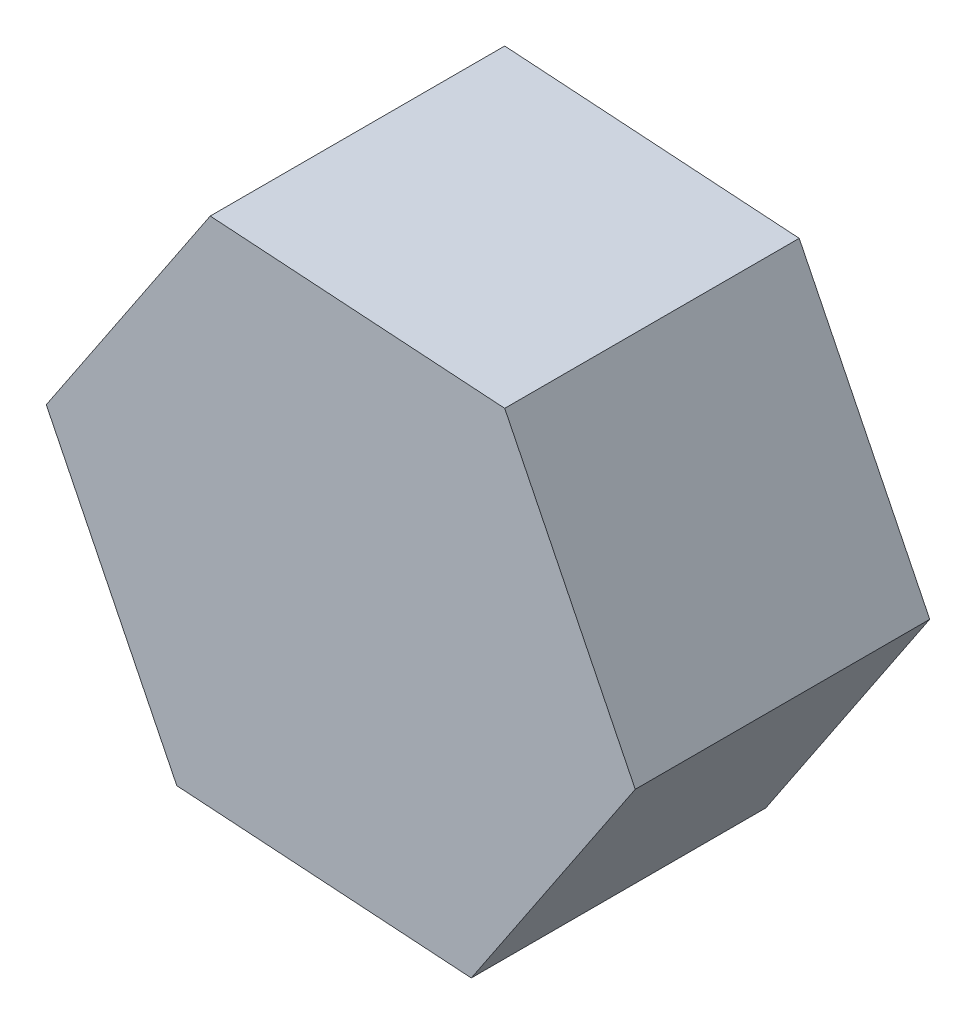
ISO-10303-21;
HEADER;
FILE_DESCRIPTION(('STEP AP214'),'2;1');
FILE_NAME('part.step','',(''),(''),'','','');
FILE_SCHEMA(('AUTOMOTIVE_DESIGN { 1 0 10303 214 1 1 1 1 }'));
ENDSEC;
DATA;
#1=APPLICATION_CONTEXT('core data for automotive mechanical design processes');
#2=APPLICATION_PROTOCOL_DEFINITION('international standard','automotive_design',2000,#1);
#3=PRODUCT_CONTEXT('',#1,'mechanical');
#4=PRODUCT('Part','Part','',(#3));
#5=PRODUCT_RELATED_PRODUCT_CATEGORY('part','',(#4));
#6=PRODUCT_DEFINITION_FORMATION('','',#4);
#7=PRODUCT_DEFINITION_CONTEXT('part definition',#1,'design');
#8=PRODUCT_DEFINITION('design','',#6,#7);
#9=PRODUCT_DEFINITION_SHAPE('','',#8);
#10=(LENGTH_UNIT() NAMED_UNIT(*) SI_UNIT(.MILLI.,.METRE.));
#11=(NAMED_UNIT(*) PLANE_ANGLE_UNIT() SI_UNIT($,.RADIAN.));
#12=(NAMED_UNIT(*) SI_UNIT($,.STERADIAN.) SOLID_ANGLE_UNIT());
#13=UNCERTAINTY_MEASURE_WITH_UNIT(LENGTH_MEASURE(1.E-05),#10,'distance_accuracy_value','');
#14=(GEOMETRIC_REPRESENTATION_CONTEXT(3) GLOBAL_UNCERTAINTY_ASSIGNED_CONTEXT((#13)) GLOBAL_UNIT_ASSIGNED_CONTEXT((#10,
#11,#12)) REPRESENTATION_CONTEXT('',''));
#15=CARTESIAN_POINT('',(0.,0.,0.));
#16=DIRECTION('',(0.,0.,1.));
#17=DIRECTION('',(1.,0.,0.));
#18=AXIS2_PLACEMENT_3D('',#15,#16,#17);
#19=CARTESIAN_POINT('',(12.,-0.786541064159204,12.));
#20=DIRECTION('',(-0.896873457556997,-0.442287238262374,0.));
#21=DIRECTION('',(0.442287238262374,-0.896873457556997,0.));
#22=AXIS2_PLACEMENT_3D('',#19,#20,#21);
#23=PLANE('',#22);
#24=DIRECTION('',(-0.442287238262374,0.896873457556997,0.));
#25=VECTOR('',#24,1.);
#26=CARTESIAN_POINT('',(12.,-0.786541064159204,0.));
#27=LINE('',#26,#25);
#28=CARTESIAN_POINT('',(12.,-0.786541064159204,0.));
#29=VERTEX_POINT('',#28);
#30=CARTESIAN_POINT('',(6.68116454268152,9.99903431333366,0.));
#31=VERTEX_POINT('',#30);
#32=EDGE_CURVE('E121',#29,#31,#27,.T.);
#33=ORIENTED_EDGE('',*,*,#32,.T.);
#34=DIRECTION('',(0.,0.,-1.));
#35=VECTOR('',#34,1.);
#36=CARTESIAN_POINT('',(6.68116454268152,9.99903431333366,12.));
#37=LINE('',#36,#35);
#38=CARTESIAN_POINT('',(6.68116454268152,9.99903431333366,12.));
#39=VERTEX_POINT('',#38);
#40=EDGE_CURVE('E11',#39,#31,#37,.T.);
#41=ORIENTED_EDGE('',*,*,#40,.F.);
#42=DIRECTION('',(-0.442287238262374,0.896873457556997,0.));
#43=VECTOR('',#42,1.);
#44=CARTESIAN_POINT('',(12.,-0.786541064159204,12.));
#45=LINE('',#44,#43);
#46=CARTESIAN_POINT('',(12.,-0.786541064159204,12.));
#47=VERTEX_POINT('',#46);
#48=EDGE_CURVE('E131',#47,#39,#45,.T.);
#49=ORIENTED_EDGE('',*,*,#48,.F.);
#50=DIRECTION('',(0.,0.,-1.));
#51=VECTOR('',#50,1.);
#52=CARTESIAN_POINT('',(12.,-0.786541064159204,12.));
#53=LINE('',#52,#51);
#54=EDGE_CURVE('E117',#47,#29,#53,.T.);
#55=ORIENTED_EDGE('',*,*,#54,.T.);
#56=EDGE_LOOP('',(#33,#41,#49,#55));
#57=FACE_BOUND('',#56,.T.);
#58=ADVANCED_FACE('F37',(#57),#23,.F.);
#59=CARTESIAN_POINT('',(6.68116454268152,9.99903431333366,12.));
#60=DIRECTION('',(-0.0654047446736224,-0.997858817355531,0.));
#61=DIRECTION('',(0.997858817355531,-0.0654047446736224,0.));
#62=AXIS2_PLACEMENT_3D('',#59,#60,#61);
#63=PLANE('',#62);
#64=DIRECTION('',(-0.997858817355531,0.0654047446736224,0.));
#65=VECTOR('',#64,1.);
#66=CARTESIAN_POINT('',(6.68116454268152,9.99903431333366,0.));
#67=LINE('',#66,#65);
#68=CARTESIAN_POINT('',(-5.31883545731848,10.7855753774929,0.));
#69=VERTEX_POINT('',#68);
#70=EDGE_CURVE('E124',#31,#69,#67,.T.);
#71=ORIENTED_EDGE('',*,*,#70,.T.);
#72=DIRECTION('',(0.,0.,-1.));
#73=VECTOR('',#72,1.);
#74=CARTESIAN_POINT('',(-5.31883545731848,10.7855753774929,12.));
#75=LINE('',#74,#73);
#76=CARTESIAN_POINT('',(-5.31883545731848,10.7855753774929,12.));
#77=VERTEX_POINT('',#76);
#78=EDGE_CURVE('E45',#77,#69,#75,.T.);
#79=ORIENTED_EDGE('',*,*,#78,.F.);
#80=DIRECTION('',(-0.997858817355531,0.0654047446736224,0.));
#81=VECTOR('',#80,1.);
#82=CARTESIAN_POINT('',(6.68116454268152,9.99903431333366,12.));
#83=LINE('',#82,#81);
#84=EDGE_CURVE('E90',#39,#77,#83,.T.);
#85=ORIENTED_EDGE('',*,*,#84,.F.);
#86=ORIENTED_EDGE('',*,*,#40,.T.);
#87=EDGE_LOOP('',(#71,#79,#85,#86));
#88=FACE_BOUND('',#87,.T.);
#89=ADVANCED_FACE('F155',(#88),#63,.F.);
#90=CARTESIAN_POINT('',(-5.31883545731848,10.7855753774929,12.));
#91=DIRECTION('',(0.831468712883375,-0.555571579093157,0.));
#92=DIRECTION('',(0.555571579093157,0.831468712883375,0.));
#93=AXIS2_PLACEMENT_3D('',#90,#91,#92);
#94=PLANE('',#93);
#95=DIRECTION('',(-0.555571579093157,-0.831468712883375,0.));
#96=VECTOR('',#95,1.);
#97=CARTESIAN_POINT('',(-5.31883545731848,10.7855753774929,0.));
#98=LINE('',#97,#96);
#99=CARTESIAN_POINT('',(-12.,0.786541064159204,0.));
#100=VERTEX_POINT('',#99);
#101=EDGE_CURVE('E126',#69,#100,#98,.T.);
#102=ORIENTED_EDGE('',*,*,#101,.T.);
#103=DIRECTION('',(0.,0.,-1.));
#104=VECTOR('',#103,1.);
#105=CARTESIAN_POINT('',(-12.,0.786541064159204,12.));
#106=LINE('',#105,#104);
#107=CARTESIAN_POINT('',(-12.,0.786541064159204,12.));
#108=VERTEX_POINT('',#107);
#109=EDGE_CURVE('E112',#108,#100,#106,.T.);
#110=ORIENTED_EDGE('',*,*,#109,.F.);
#111=DIRECTION('',(-0.555571579093157,-0.831468712883375,0.));
#112=VECTOR('',#111,1.);
#113=CARTESIAN_POINT('',(-5.31883545731848,10.7855753774929,12.));
#114=LINE('',#113,#112);
#115=EDGE_CURVE('E103',#77,#108,#114,.T.);
#116=ORIENTED_EDGE('',*,*,#115,.F.);
#117=ORIENTED_EDGE('',*,*,#78,.T.);
#118=EDGE_LOOP('',(#102,#110,#116,#117));
#119=FACE_BOUND('',#118,.T.);
#120=ADVANCED_FACE('F137',(#119),#94,.F.);
#121=CARTESIAN_POINT('',(-12.,0.786541064159204,12.));
#122=DIRECTION('',(0.896873457556997,0.442287238262374,0.));
#123=DIRECTION('',(-0.442287238262374,0.896873457556997,0.));
#124=AXIS2_PLACEMENT_3D('',#121,#122,#123);
#125=PLANE('',#124);
#126=DIRECTION('',(0.442287238262374,-0.896873457556997,0.));
#127=VECTOR('',#126,1.);
#128=CARTESIAN_POINT('',(-12.,0.786541064159204,0.));
#129=LINE('',#128,#127);
#130=CARTESIAN_POINT('',(-6.68116454268151,-9.99903431333367,0.));
#131=VERTEX_POINT('',#130);
#132=EDGE_CURVE('E111',#100,#131,#129,.T.);
#133=ORIENTED_EDGE('',*,*,#132,.T.);
#134=DIRECTION('',(0.,0.,-1.));
#135=VECTOR('',#134,1.);
#136=CARTESIAN_POINT('',(-6.68116454268151,-9.99903431333367,12.));
#137=LINE('',#136,#135);
#138=CARTESIAN_POINT('',(-6.68116454268151,-9.99903431333367,12.));
#139=VERTEX_POINT('',#138);
#140=EDGE_CURVE('E108',#139,#131,#137,.T.);
#141=ORIENTED_EDGE('',*,*,#140,.F.);
#142=DIRECTION('',(0.442287238262374,-0.896873457556997,0.));
#143=VECTOR('',#142,1.);
#144=CARTESIAN_POINT('',(-12.,0.786541064159204,12.));
#145=LINE('',#144,#143);
#146=EDGE_CURVE('E97',#108,#139,#145,.T.);
#147=ORIENTED_EDGE('',*,*,#146,.F.);
#148=ORIENTED_EDGE('',*,*,#109,.T.);
#149=EDGE_LOOP('',(#133,#141,#147,#148));
#150=FACE_BOUND('',#149,.T.);
#151=ADVANCED_FACE('F109',(#150),#125,.F.);
#152=CARTESIAN_POINT('',(-6.68116454268151,-9.99903431333367,12.));
#153=DIRECTION('',(0.0654047446736221,0.997858817355531,0.));
#154=DIRECTION('',(-0.997858817355531,0.0654047446736221,0.));
#155=AXIS2_PLACEMENT_3D('',#152,#153,#154);
#156=PLANE('',#155);
#157=DIRECTION('',(0.997858817355531,-0.0654047446736221,0.));
#158=VECTOR('',#157,1.);
#159=CARTESIAN_POINT('',(-6.68116454268151,-9.99903431333367,0.));
#160=LINE('',#159,#158);
#161=CARTESIAN_POINT('',(5.31883545731849,-10.7855753774929,0.));
#162=VERTEX_POINT('',#161);
#163=EDGE_CURVE('E76',#131,#162,#160,.T.);
#164=ORIENTED_EDGE('',*,*,#163,.T.);
#165=DIRECTION('',(0.,0.,-1.));
#166=VECTOR('',#165,1.);
#167=CARTESIAN_POINT('',(5.31883545731849,-10.7855753774929,12.));
#168=LINE('',#167,#166);
#169=CARTESIAN_POINT('',(5.31883545731849,-10.7855753774929,12.));
#170=VERTEX_POINT('',#169);
#171=EDGE_CURVE('E113',#170,#162,#168,.T.);
#172=ORIENTED_EDGE('',*,*,#171,.F.);
#173=DIRECTION('',(0.997858817355531,-0.0654047446736221,0.));
#174=VECTOR('',#173,1.);
#175=CARTESIAN_POINT('',(-6.68116454268151,-9.99903431333367,12.));
#176=LINE('',#175,#174);
#177=EDGE_CURVE('E101',#139,#170,#176,.T.);
#178=ORIENTED_EDGE('',*,*,#177,.F.);
#179=ORIENTED_EDGE('',*,*,#140,.T.);
#180=EDGE_LOOP('',(#164,#172,#178,#179));
#181=FACE_BOUND('',#180,.T.);
#182=ADVANCED_FACE('F115',(#181),#156,.F.);
#183=CARTESIAN_POINT('',(5.31883545731849,-10.7855753774929,12.));
#184=DIRECTION('',(-0.831468712883375,0.555571579093157,0.));
#185=DIRECTION('',(-0.555571579093157,-0.831468712883375,0.));
#186=AXIS2_PLACEMENT_3D('',#183,#184,#185);
#187=PLANE('',#186);
#188=DIRECTION('',(0.555571579093157,0.831468712883375,0.));
#189=VECTOR('',#188,1.);
#190=CARTESIAN_POINT('',(5.31883545731849,-10.7855753774929,0.));
#191=LINE('',#190,#189);
#192=EDGE_CURVE('E82',#162,#29,#191,.T.);
#193=ORIENTED_EDGE('',*,*,#192,.T.);
#194=ORIENTED_EDGE('',*,*,#54,.F.);
#195=DIRECTION('',(0.555571579093157,0.831468712883375,0.));
#196=VECTOR('',#195,1.);
#197=CARTESIAN_POINT('',(5.31883545731849,-10.7855753774929,12.));
#198=LINE('',#197,#196);
#199=EDGE_CURVE('E53',#170,#47,#198,.T.);
#200=ORIENTED_EDGE('',*,*,#199,.F.);
#201=ORIENTED_EDGE('',*,*,#171,.T.);
#202=EDGE_LOOP('',(#193,#194,#200,#201));
#203=FACE_BOUND('',#202,.T.);
#204=ADVANCED_FACE('F144',(#203),#187,.F.);
#205=CARTESIAN_POINT('',(0.,0.,12.));
#206=DIRECTION('',(0.,0.,1.));
#207=DIRECTION('',(1.,0.,0.));
#208=AXIS2_PLACEMENT_3D('',#205,#206,#207);
#209=PLANE('',#208);
#210=ORIENTED_EDGE('',*,*,#48,.T.);
#211=ORIENTED_EDGE('',*,*,#84,.T.);
#212=ORIENTED_EDGE('',*,*,#115,.T.);
#213=ORIENTED_EDGE('',*,*,#146,.T.);
#214=ORIENTED_EDGE('',*,*,#177,.T.);
#215=ORIENTED_EDGE('',*,*,#199,.T.);
#216=EDGE_LOOP('',(#210,#211,#212,#213,#214,#215));
#217=FACE_BOUND('',#216,.T.);
#218=ADVANCED_FACE('F99',(#217),#209,.T.);
#219=CARTESIAN_POINT('',(0.,0.,0.));
#220=DIRECTION('',(0.,0.,1.));
#221=DIRECTION('',(1.,0.,0.));
#222=AXIS2_PLACEMENT_3D('',#219,#220,#221);
#223=PLANE('',#222);
#224=ORIENTED_EDGE('',*,*,#32,.F.);
#225=ORIENTED_EDGE('',*,*,#192,.F.);
#226=ORIENTED_EDGE('',*,*,#163,.F.);
#227=ORIENTED_EDGE('',*,*,#132,.F.);
#228=ORIENTED_EDGE('',*,*,#101,.F.);
#229=ORIENTED_EDGE('',*,*,#70,.F.);
#230=EDGE_LOOP('',(#224,#225,#226,#227,#228,#229));
#231=FACE_BOUND('',#230,.T.);
#232=ADVANCED_FACE('F140',(#231),#223,.F.);
#233=CLOSED_SHELL('',(#58,#89,#120,#151,#182,#204,#218,#232));
#234=MANIFOLD_SOLID_BREP('B2',#233);
#235=ADVANCED_BREP_SHAPE_REPRESENTATION('',(#18,#234),#14);
#236=SHAPE_DEFINITION_REPRESENTATION(#9,#235);
ENDSEC;
END-ISO-10303-21;
